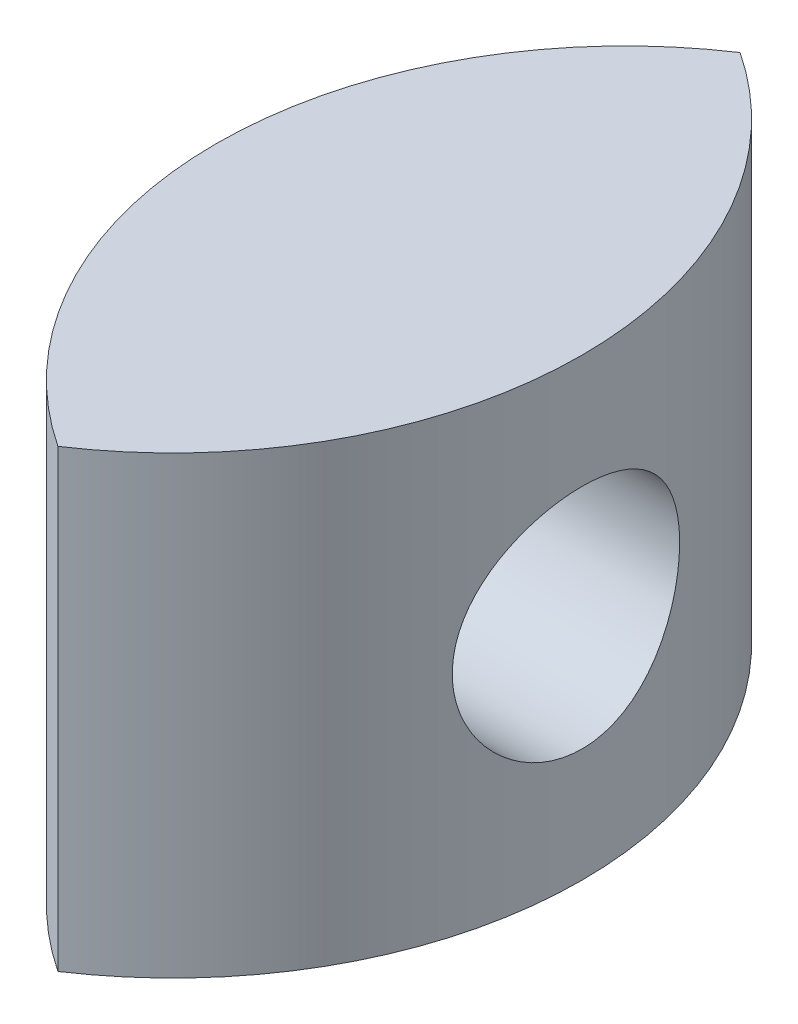
ISO-10303-21;
HEADER;
FILE_DESCRIPTION(('STEP AP214'),'2;1');
FILE_NAME('part.step','',(''),(''),'','','');
FILE_SCHEMA(('AUTOMOTIVE_DESIGN { 1 0 10303 214 1 1 1 1 }'));
ENDSEC;
DATA;
#1=APPLICATION_CONTEXT('core data for automotive mechanical design processes');
#2=APPLICATION_PROTOCOL_DEFINITION('international standard','automotive_design',2000,#1);
#3=PRODUCT_CONTEXT('',#1,'mechanical');
#4=PRODUCT('Part','Part','',(#3));
#5=PRODUCT_RELATED_PRODUCT_CATEGORY('part','',(#4));
#6=PRODUCT_DEFINITION_FORMATION('','',#4);
#7=PRODUCT_DEFINITION_CONTEXT('part definition',#1,'design');
#8=PRODUCT_DEFINITION('design','',#6,#7);
#9=PRODUCT_DEFINITION_SHAPE('','',#8);
#10=(LENGTH_UNIT() NAMED_UNIT(*) SI_UNIT(.MILLI.,.METRE.));
#11=(NAMED_UNIT(*) PLANE_ANGLE_UNIT() SI_UNIT($,.RADIAN.));
#12=(NAMED_UNIT(*) SI_UNIT($,.STERADIAN.) SOLID_ANGLE_UNIT());
#13=UNCERTAINTY_MEASURE_WITH_UNIT(LENGTH_MEASURE(1.E-05),#10,'distance_accuracy_value','');
#14=(GEOMETRIC_REPRESENTATION_CONTEXT(3) GLOBAL_UNCERTAINTY_ASSIGNED_CONTEXT((#13)) GLOBAL_UNIT_ASSIGNED_CONTEXT((#10,
#11,#12)) REPRESENTATION_CONTEXT('',''));
#15=CARTESIAN_POINT('',(0.,0.,0.));
#16=DIRECTION('',(0.,0.,1.));
#17=DIRECTION('',(1.,0.,0.));
#18=AXIS2_PLACEMENT_3D('',#15,#16,#17);
#19=CARTESIAN_POINT('',(-49.749371855331,100.,0.));
#20=DIRECTION('',(0.,-1.,0.));
#21=DIRECTION('',(0.,0.,-1.));
#22=AXIS2_PLACEMENT_3D('',#19,#20,#21);
#23=CYLINDRICAL_SURFACE('',#22,90.);
#24=CARTESIAN_POINT('',(36.7087104736219,50.,-25.));
#25=CARTESIAN_POINT('',(36.7087119584667,49.3125236925626,-24.9999978373599));
#26=CARTESIAN_POINT('',(36.7169325697667,48.6250072856748,-24.9716185127025));
#27=CARTESIAN_POINT('',(36.7495638608356,47.2550052019103,-24.8583494073153));
#28=CARTESIAN_POINT('',(36.7739758120084,46.5725199243521,-24.7734551888251));
#29=CARTESIAN_POINT('',(36.8382479200626,45.2173004770751,-24.5478683033964));
#30=CARTESIAN_POINT('',(36.8781141512689,44.5445702495854,-24.4071536956735));
#31=CARTESIAN_POINT('',(36.9720806210226,43.2139235869016,-24.0711458500836));
#32=CARTESIAN_POINT('',(37.0261806457025,42.5560069292901,-23.8758534322631));
#33=CARTESIAN_POINT('',(37.1469111934421,41.2604686096819,-23.432639854356));
#34=CARTESIAN_POINT('',(37.2135226183443,40.6228177248464,-23.184798834306));
#35=CARTESIAN_POINT('',(37.357399821172,39.3709664004644,-22.6382447832395));
#36=CARTESIAN_POINT('',(37.434665628854,38.7567660264185,-22.3395316101424));
#37=CARTESIAN_POINT('',(37.5976773926939,37.5556795277261,-21.6934079281237));
#38=CARTESIAN_POINT('',(37.6834238686412,36.9687950805483,-21.3459944337613));
#39=CARTESIAN_POINT('',(37.8610372263489,35.8259931277064,-20.604886979711));
#40=CARTESIAN_POINT('',(37.9529042218262,35.2700761977593,-20.2111921600297));
#41=CARTESIAN_POINT('',(38.1425927796659,34.1793502689555,-19.3698984655967));
#42=CARTESIAN_POINT('',(38.2405051547523,33.6453944075295,-18.9212136091496));
#43=CARTESIAN_POINT('',(38.4374559813241,32.6169214595317,-17.980936319365));
#44=CARTESIAN_POINT('',(38.5364944497509,32.1224049672011,-17.489343239754));
#45=CARTESIAN_POINT('',(38.7330020704521,31.1759499185994,-16.4663520986566));
#46=CARTESIAN_POINT('',(38.830471053198,30.7240159366495,-15.9349497717415));
#47=CARTESIAN_POINT('',(39.021182017181,29.8657920009903,-14.8357629533146));
#48=CARTESIAN_POINT('',(39.1144239738916,29.4595023121028,-14.2679782507475));
#49=CARTESIAN_POINT('',(39.2957252414571,28.6886849842625,-13.0893959348383));
#50=CARTESIAN_POINT('',(39.3836649527244,28.3250149132165,-12.4780185277527));
#51=CARTESIAN_POINT('',(39.5500566448419,27.6506205147449,-11.2254690643313));
#52=CARTESIAN_POINT('',(39.6285084814535,27.3398969922051,-10.5842965552432));
#53=CARTESIAN_POINT('',(39.773669841301,26.7739405631465,-9.27672295885907));
#54=CARTESIAN_POINT('',(39.8403810296831,26.5186997864419,-8.61032546547466));
#55=CARTESIAN_POINT('',(39.9601410213547,26.0658311904632,-7.25704033109933));
#56=CARTESIAN_POINT('',(40.0131902207225,25.8682017009431,-6.57015328477087));
#57=CARTESIAN_POINT('',(40.1029475058277,25.5364729101068,-5.19822223338651));
#58=CARTESIAN_POINT('',(40.1400275081839,25.4009224145853,-4.51355330398438));
#59=CARTESIAN_POINT('',(40.198670255679,25.187486272222,-3.1346258191073));
#60=CARTESIAN_POINT('',(40.2202332328689,25.1095997630379,-2.44036740719749));
#61=CARTESIAN_POINT('',(40.2472263675678,25.012205259846,-1.04756404807907));
#62=CARTESIAN_POINT('',(40.2526590579619,24.9926881002911,-0.349019791126764));
#63=CARTESIAN_POINT('',(40.2472432520002,25.0121864447438,1.04718219551885));
#64=CARTESIAN_POINT('',(40.2363950087114,25.0512010389484,1.74483993882321));
#65=CARTESIAN_POINT('',(40.199245475825,25.1855331760621,3.11496887722605));
#66=CARTESIAN_POINT('',(40.1733755662162,25.2792793754724,3.78760655475489));
#67=CARTESIAN_POINT('',(40.1072261654928,25.5209945309046,5.12232904057285));
#68=CARTESIAN_POINT('',(40.0669469830142,25.6689623255418,5.7844140745745));
#69=CARTESIAN_POINT('',(39.97304902464,26.0179021992923,7.09351046978246));
#70=CARTESIAN_POINT('',(39.9194297745418,26.218876162644,7.74052129424782));
#71=CARTESIAN_POINT('',(39.8002625984574,26.6722304914997,9.01513947247459));
#72=CARTESIAN_POINT('',(39.7347144713909,26.9246117235637,9.64274649894534));
#73=CARTESIAN_POINT('',(39.5926499031032,27.4817819246131,10.8809741735192));
#74=CARTESIAN_POINT('',(39.5160255106239,27.787093402063,11.4913472375099));
#75=CARTESIAN_POINT('',(39.354343378787,28.4460203740385,12.6842534843857));
#76=CARTESIAN_POINT('',(39.2692856094692,28.79963604017,13.2667865683565));
#77=CARTESIAN_POINT('',(39.0929294556891,29.5527871224068,14.4005107986214));
#78=CARTESIAN_POINT('',(39.0016299892009,29.9523305085074,14.9516964802118));
#79=CARTESIAN_POINT('',(38.8151608709692,30.7946594140811,16.0192770250537));
#80=CARTESIAN_POINT('',(38.7199911312508,31.2374459168294,16.5356710967517));
#81=CARTESIAN_POINT('',(38.5250488459202,32.1788788233121,17.5470989477399));
#82=CARTESIAN_POINT('',(38.4252284926243,32.6788933390497,18.0408509618632));
#83=CARTESIAN_POINT('',(38.2268499473707,33.7188426844479,18.9846518119587));
#84=CARTESIAN_POINT('',(38.1282917842011,34.2587784227399,19.4346996526578));
#85=CARTESIAN_POINT('',(37.9352027673689,35.3751302361837,20.2880960277346));
#86=CARTESIAN_POINT('',(37.840672234763,35.9515492104741,20.6914408436347));
#87=CARTESIAN_POINT('',(37.6583584004496,37.1370958253791,21.4485517286687));
#88=CARTESIAN_POINT('',(37.570575068501,37.7462233193722,21.8023180200212));
#89=CARTESIAN_POINT('',(37.4037326248509,38.9976874823907,22.460017444599));
#90=CARTESIAN_POINT('',(37.3247411645812,39.6402323802443,22.7635718652146));
#91=CARTESIAN_POINT('',(37.1786381148792,40.9500070582156,23.3152865727226));
#92=CARTESIAN_POINT('',(37.1115266277292,41.6172370508035,23.5634463826917));
#93=CARTESIAN_POINT('',(36.9913105607596,42.9714394907617,24.0022041362588));
#94=CARTESIAN_POINT('',(36.9382028520022,43.6584074898598,24.1928149397158));
#95=CARTESIAN_POINT('',(36.8476911397912,45.0470954586523,24.5148265178322));
#96=CARTESIAN_POINT('',(36.810286609358,45.7488149324751,24.6462292794522));
#97=CARTESIAN_POINT('',(36.7533452816235,47.1387757997168,24.845327209416));
#98=CARTESIAN_POINT('',(36.733270444918,47.8267205713889,24.9149428109611));
#99=CARTESIAN_POINT('',(36.7096032261963,49.2062906176748,24.9969493330663));
#100=CARTESIAN_POINT('',(36.706010490746,49.897915813049,25.0093414806982));
#101=CARTESIAN_POINT('',(36.7154198686201,51.2796241689367,24.9767905920429));
#102=CARTESIAN_POINT('',(36.7284202109627,51.9697074861408,24.9318536744962));
#103=CARTESIAN_POINT('',(36.7706046109094,53.3432876393305,24.7850658076762));
#104=CARTESIAN_POINT('',(36.7997885660947,54.0267845169709,24.6832152185838));
#105=CARTESIAN_POINT('',(36.8726445435354,55.3677184398248,24.426290275045));
#106=CARTESIAN_POINT('',(36.9159938526697,56.0254002912682,24.2723990037764));
#107=CARTESIAN_POINT('',(37.01605175114,57.3252057708842,23.9122595274744));
#108=CARTESIAN_POINT('',(37.0727601007662,57.9673296779949,23.7060122618931));
#109=CARTESIAN_POINT('',(37.1979203969383,59.2318793074743,23.242759929531));
#110=CARTESIAN_POINT('',(37.2663735564689,59.8543029873634,22.9857496196116));
#111=CARTESIAN_POINT('',(37.4131102251169,61.0754588922896,22.4228956768783));
#112=CARTESIAN_POINT('',(37.4913939732643,61.6741905407915,22.1170508566087));
#113=CARTESIAN_POINT('',(37.6576020020037,62.8580976919112,21.4509085207493));
#114=CARTESIAN_POINT('',(37.7457100660614,63.4426207290157,21.0894971544419));
#115=CARTESIAN_POINT('',(37.9275509517091,64.579357084396,20.3202693194868));
#116=CARTESIAN_POINT('',(38.0212838436353,65.1315699984753,19.9124522704966));
#117=CARTESIAN_POINT('',(38.2118462754509,66.2003862040661,19.0530263039524));
#118=CARTESIAN_POINT('',(38.3086763620161,66.7169831577777,18.6014096265639));
#119=CARTESIAN_POINT('',(38.5028333006917,67.7112820407914,17.6573073311238));
#120=CARTESIAN_POINT('',(38.6001601616814,68.188983272279,17.1648209801637));
#121=CARTESIAN_POINT('',(38.795798173433,69.1169923323564,16.1257881399337));
#122=CARTESIAN_POINT('',(38.8940425760459,69.5659501146415,15.578022190826));
#123=CARTESIAN_POINT('',(39.0855775790339,70.4161663933819,14.4458076704574));
#124=CARTESIAN_POINT('',(39.1788680643244,70.8174237819762,13.8613582476895));
#125=CARTESIAN_POINT('',(39.3578776047622,71.5693132751692,12.6596621259657));
#126=CARTESIAN_POINT('',(39.4435968733828,71.9199468073035,12.0424163525017));
#127=CARTESIAN_POINT('',(39.6050463073952,72.5679095779847,10.7792977426945));
#128=CARTESIAN_POINT('',(39.6807766458626,72.8652397401375,10.1334254026157));
#129=CARTESIAN_POINT('',(39.8195524727038,73.4021145949293,8.82262779743002));
#130=CARTESIAN_POINT('',(39.8826911016637,73.6420864097035,8.15788742610678));
#131=CARTESIAN_POINT('',(39.9952092180105,74.0651501858568,6.80939610883582));
#132=CARTESIAN_POINT('',(40.0445887266703,74.2482422351771,6.12564519228184));
#133=CARTESIAN_POINT('',(40.1281560625103,74.5558946737658,4.7443235570145));
#134=CARTESIAN_POINT('',(40.1623469467236,74.6804668416928,4.04675564881526));
#135=CARTESIAN_POINT('',(40.2145539830851,74.8699875943931,2.64297268493984));
#136=CARTESIAN_POINT('',(40.2325705869248,74.9349378442011,1.93675787130007));
#137=CARTESIAN_POINT('',(40.2515821157602,75.0034542524176,0.544682643020258));
#138=CARTESIAN_POINT('',(40.2531228499611,75.0089887484824,-0.141074199452578));
#139=CARTESIAN_POINT('',(40.2405556929542,74.9637244929425,-1.51057082638391));
#140=CARTESIAN_POINT('',(40.2264481715733,74.9129270726718,-2.194310658129));
#141=CARTESIAN_POINT('',(40.18297305304,74.7554513014685,-3.5547927229615));
#142=CARTESIAN_POINT('',(40.153606184799,74.6487756197374,-4.23153528872095));
#143=CARTESIAN_POINT('',(40.0804141489003,74.3804653597566,-5.5732354365324));
#144=CARTESIAN_POINT('',(40.0365889181396,74.2188305416394,-6.23819296713563));
#145=CARTESIAN_POINT('',(39.9360731046549,73.843477754109,-7.54638360915876));
#146=CARTESIAN_POINT('',(39.8794892908089,73.6301909903742,-8.18974880531733));
#147=CARTESIAN_POINT('',(39.7547496023096,73.1525564334994,-9.45605929388641));
#148=CARTESIAN_POINT('',(39.6865938338586,72.8882091089683,-10.0790047736377));
#149=CARTESIAN_POINT('',(39.5404697486794,72.3103991911703,-11.3005604171818));
#150=CARTESIAN_POINT('',(39.4625003307066,71.9969310848172,-11.8991678398755));
#151=CARTESIAN_POINT('',(39.2987540364114,71.3231210237317,-13.068272663989));
#152=CARTESIAN_POINT('',(39.2129769739244,70.9627779512301,-13.6387693946406));
#153=CARTESIAN_POINT('',(39.0332730862021,70.1867411316319,-14.7640024155415));
#154=CARTESIAN_POINT('',(38.9391837751556,69.7697637528657,-15.3178277741033));
#155=CARTESIAN_POINT('',(38.7475728074383,68.8916060387937,-16.3886145654833));
#156=CARTESIAN_POINT('',(38.6500510867078,68.4304248782279,-16.9055753097455));
#157=CARTESIAN_POINT('',(38.4541664338442,67.46673260844,-17.8995117381229));
#158=CARTESIAN_POINT('',(38.3558032929429,66.9642109588776,-18.3764771618823));
#159=CARTESIAN_POINT('',(38.1609211828342,65.9211207391434,-19.2872316187364));
#160=CARTESIAN_POINT('',(38.0644022241579,65.3805519517866,-19.7210204053311));
#161=CARTESIAN_POINT('',(37.8735490253337,64.2510884896215,-20.5526207350675));
#162=CARTESIAN_POINT('',(37.7793259849993,63.6613351334835,-20.9492926174597));
#163=CARTESIAN_POINT('',(37.5983620716777,62.4493214585279,-21.6914579896037));
#164=CARTESIAN_POINT('',(37.5116215277266,61.827059712113,-22.0369492292114));
#165=CARTESIAN_POINT('',(37.3482851380401,60.5546060269124,-22.6739111838681));
#166=CARTESIAN_POINT('',(37.2716839699025,59.9044289808311,-22.9654102730433));
#167=CARTESIAN_POINT('',(37.1309523820672,58.5804293555306,-23.492204951125));
#168=CARTESIAN_POINT('',(37.0668204114058,57.9066097293843,-23.7275075307884));
#169=CARTESIAN_POINT('',(36.9613576028578,56.6399485557023,-24.1098046923847));
#170=CARTESIAN_POINT('',(36.9180653457087,56.0496329226893,-24.2646740847685));
#171=CARTESIAN_POINT('',(36.843080596557,54.8585916152782,-24.5309265104396));
#172=CARTESIAN_POINT('',(36.8113867895949,54.2578671290634,-24.6423144734734));
#173=CARTESIAN_POINT('',(36.7603653174863,53.0494252917887,-24.8208382513816));
#174=CARTESIAN_POINT('',(36.7410362264239,52.441708755293,-24.8879791689127));
#175=CARTESIAN_POINT('',(36.7152075259606,51.2226722771844,-24.97756315902));
#176=CARTESIAN_POINT('',(36.7087091531941,50.6113519939344,-25.0000019231708));
#177=CARTESIAN_POINT('',(36.7087104736219,50.,-25.));
#178=B_SPLINE_CURVE_WITH_KNOTS('',3,(#24,#25,#26,#27,#28,#29,#30,#31,#32,#33,#34,#35,#36,#37,
#38,#39,#40,#41,#42,#43,#44,#45,#46,#47,#48,#49,#50,#51,#52,#53,#54,#55,#56,#57,#58,#59,#60,#61,
#62,#63,#64,#65,#66,#67,#68,#69,#70,#71,#72,#73,#74,#75,#76,#77,#78,#79,#80,#81,#82,#83,#84,#85,
#86,#87,#88,#89,#90,#91,#92,#93,#94,#95,#96,#97,#98,#99,#100,#101,#102,#103,#104,#105,#106,#107,
#108,#109,#110,#111,#112,#113,#114,#115,#116,#117,#118,#119,#120,#121,#122,#123,#124,#125,#126,
#127,#128,#129,#130,#131,#132,#133,#134,#135,#136,#137,#138,#139,#140,#141,#142,#143,#144,#145,
#146,#147,#148,#149,#150,#151,#152,#153,#154,#155,#156,#157,#158,#159,#160,#161,#162,#163,#164,
#165,#166,#167,#168,#169,#170,#171,#172,#173,#174,#175,#176,#177),.UNSPECIFIED.,.T.,.F.,(4,2,2,
2,2,2,2,2,2,2,2,2,2,2,2,2,2,2,2,2,2,2,2,2,2,2,2,2,2,2,2,2,2,2,2,2,2,2,2,2,2,2,2,2,2,2,2,2,2,2,2,
2,2,2,2,2,2,2,2,2,2,2,2,2,2,2,2,2,2,2,2,2,2,2,2,2,4),(0.,2.06186635872091,4.12389464198301,
6.18673423126287,8.24954282747685,10.3092278480517,12.3689186212039,14.4287357133568,
16.4885910868019,18.5990110240664,20.7094627534622,22.8201409350754,24.9308313619095,
27.0785457811604,29.2262928467468,31.373735056933,33.5211150030388,35.6153519914709,
37.7095576607769,39.8034344665752,41.8972787260055,43.9337748658363,45.9702273880454,
48.0067523108745,50.0433115657647,52.1012569520474,54.1592096495928,56.2175200114108,
58.275877186622,60.4026979988959,62.5295672338082,64.65660569299,66.7836346181512,
68.9260391167482,71.0684620597925,73.2104059036261,75.3522778606826,77.4249763087515,
79.4976303106775,81.5700631164076,83.6424828068007,85.6706444581721,87.6987697197007,
89.7271045688942,91.7554887464187,93.8316977078738,95.9079326369407,97.9845360799451,
100.061176770354,102.20370593841,104.346284857853,106.488803347175,108.631284708745,
110.757276907373,112.883265819015,115.008826636178,117.13432809195,119.189189282819,
121.244001910658,123.298716392832,125.353439842863,127.391567842159,129.4296771374,
131.468015344528,133.506402166289,135.602814298249,137.699265576679,139.796253041441,
141.893252477438,144.041549109183,146.189940162234,148.33719896264,150.484190508147,
152.317988984533,154.15157949193,155.984958509028,157.818514219957),.UNSPECIFIED.);
#179=CARTESIAN_POINT('',(36.7087104736219,50.,-25.));
#180=VERTEX_POINT('',#179);
#181=EDGE_CURVE('E76',#180,#180,#178,.T.);
#182=ORIENTED_EDGE('',*,*,#181,.T.);
#183=EDGE_LOOP('',(#182));
#184=FACE_BOUND('',#183,.T.);
#185=CARTESIAN_POINT('',(-49.749371855331,0.,0.));
#186=DIRECTION('',(0.,1.,0.));
#187=DIRECTION('',(0.,0.,-1.));
#188=AXIS2_PLACEMENT_3D('',#185,#186,#187);
#189=CIRCLE('',#188,90.);
#190=CARTESIAN_POINT('',(0.,0.,75.));
#191=VERTEX_POINT('',#190);
#192=CARTESIAN_POINT('',(0.,0.,-75.));
#193=VERTEX_POINT('',#192);
#194=EDGE_CURVE('E71',#191,#193,#189,.T.);
#195=ORIENTED_EDGE('',*,*,#194,.T.);
#196=DIRECTION('',(0.,-1.,0.));
#197=VECTOR('',#196,1.);
#198=CARTESIAN_POINT('',(0.,100.,-75.));
#199=LINE('',#198,#197);
#200=CARTESIAN_POINT('',(0.,100.,-75.));
#201=VERTEX_POINT('',#200);
#202=EDGE_CURVE('E46',#201,#193,#199,.T.);
#203=ORIENTED_EDGE('',*,*,#202,.F.);
#204=CARTESIAN_POINT('',(-49.749371855331,100.,0.));
#205=DIRECTION('',(0.,1.,0.));
#206=DIRECTION('',(0.,0.,-1.));
#207=AXIS2_PLACEMENT_3D('',#204,#205,#206);
#208=CIRCLE('',#207,90.);
#209=CARTESIAN_POINT('',(0.,100.,75.));
#210=VERTEX_POINT('',#209);
#211=EDGE_CURVE('E70',#210,#201,#208,.T.);
#212=ORIENTED_EDGE('',*,*,#211,.F.);
#213=DIRECTION('',(0.,-1.,0.));
#214=VECTOR('',#213,1.);
#215=CARTESIAN_POINT('',(0.,100.,75.));
#216=LINE('',#215,#214);
#217=EDGE_CURVE('E66',#210,#191,#216,.T.);
#218=ORIENTED_EDGE('',*,*,#217,.T.);
#219=EDGE_LOOP('',(#195,#203,#212,#218));
#220=FACE_BOUND('',#219,.T.);
#221=ADVANCED_FACE('F33',(#184,#220),#23,.T.);
#222=CARTESIAN_POINT('',(49.749371855331,100.,0.));
#223=DIRECTION('',(0.,-1.,0.));
#224=DIRECTION('',(0.,0.,-1.));
#225=AXIS2_PLACEMENT_3D('',#222,#223,#224);
#226=CYLINDRICAL_SURFACE('',#225,90.);
#227=CARTESIAN_POINT('',(-40.250628144669,25.,0.));
#228=CARTESIAN_POINT('',(-40.2506268480176,25.0000021362431,-0.688053459027479));
#229=CARTESIAN_POINT('',(-40.2427186551199,25.0284287480261,-1.37614682998241));
#230=CARTESIAN_POINT('',(-40.2113009553364,25.1418910713903,-2.74731932276445));
#231=CARTESIAN_POINT('',(-40.1877902343999,25.2269311881358,-3.43039805021415));
#232=CARTESIAN_POINT('',(-40.1258055204413,25.4529165033049,-4.78681414914998));
#233=CARTESIAN_POINT('',(-40.0873259599821,25.5938825029165,-5.46014779933895));
#234=CARTESIAN_POINT('',(-39.9964586417845,25.9305104860859,-6.7920162917443));
#235=CARTESIAN_POINT('',(-39.9440711044393,26.1261716029185,-7.45055136828744));
#236=CARTESIAN_POINT('',(-39.8268874562877,26.5702751198056,-8.74740678064957));
#237=CARTESIAN_POINT('',(-39.7621084858589,26.8186446625646,-9.38575363670099));
#238=CARTESIAN_POINT('',(-39.6218233005119,27.3663840619337,-10.6389412929378));
#239=CARTESIAN_POINT('',(-39.546317055247,27.6657540628216,-11.2537820266196));
#240=CARTESIAN_POINT('',(-39.3865625461653,28.3132941337391,-12.4560429901888));
#241=CARTESIAN_POINT('',(-39.3023138451703,28.661466644509,-13.043461846677));
#242=CARTESIAN_POINT('',(-39.127274419653,29.4041641629519,-14.1871951491561));
#243=CARTESIAN_POINT('',(-39.0364835810925,29.7986899787008,-14.7435090526455));
#244=CARTESIAN_POINT('',(-38.8486246525163,30.6408371751582,-15.8337573744878));
#245=CARTESIAN_POINT('',(-38.7514613370259,31.0894526745427,-16.366907697019));
#246=CARTESIAN_POINT('',(-38.5553874292287,32.029420294012,-17.3937568238539));
#247=CARTESIAN_POINT('',(-38.4564768124007,32.5207730142414,-17.8874550739584));
#248=CARTESIAN_POINT('',(-38.2595901181671,33.5431180590779,-18.8323013375951));
#249=CARTESIAN_POINT('',(-38.1616141676416,34.0741156814616,-19.2834436460489));
#250=CARTESIAN_POINT('',(-37.9693130843845,35.1723264356013,-20.1401365762106));
#251=CARTESIAN_POINT('',(-37.8749879797883,35.7395398463675,-20.5456868466064));
#252=CARTESIAN_POINT('',(-37.6909161745075,36.9176174522083,-21.3156213668648));
#253=CARTESIAN_POINT('',(-37.6012896240817,37.5291038269768,-21.6790832357307));
#254=CARTESIAN_POINT('',(-37.4312564040614,38.78184600464,-22.3530516446004));
#255=CARTESIAN_POINT('',(-37.350849881256,39.4231022812635,-22.6635573415443));
#256=CARTESIAN_POINT('',(-37.2017377569871,40.7308415774341,-23.229078839595));
#257=CARTESIAN_POINT('',(-37.1330303150996,41.3973206088999,-23.4841033703972));
#258=CARTESIAN_POINT('',(-37.0094710677334,42.7508026061808,-23.9365461654151));
#259=CARTESIAN_POINT('',(-36.9546188453153,43.4378049537005,-24.1339661631278));
#260=CARTESIAN_POINT('',(-36.8616888872157,44.8102870353686,-24.4653441227014));
#261=CARTESIAN_POINT('',(-36.8232352633093,45.4953966133471,-24.6007301493586));
#262=CARTESIAN_POINT('',(-36.7624140993017,46.8752439428144,-24.8137705005281));
#263=CARTESIAN_POINT('',(-36.7400463210227,47.569981551589,-24.8914256798428));
#264=CARTESIAN_POINT('',(-36.7121137868327,48.9637334544335,-24.9882782923526));
#265=CARTESIAN_POINT('',(-36.7065460456545,49.6627469665779,-25.0074861113031));
#266=CARTESIAN_POINT('',(-36.7123847152531,51.0598487822997,-24.9872921698781));
#267=CARTESIAN_POINT('',(-36.7237908229197,51.7579371021758,-24.9478914561038));
#268=CARTESIAN_POINT('',(-36.7626060783818,53.1266626945488,-24.8129479297352));
#269=CARTESIAN_POINT('',(-36.7895162352533,53.7974875664439,-24.7191551122261));
#270=CARTESIAN_POINT('',(-36.8581362130491,55.128569951887,-24.4776486170805));
#271=CARTESIAN_POINT('',(-36.8998456881758,55.788827711967,-24.3299361993148));
#272=CARTESIAN_POINT('',(-36.9968406521905,57.0943071002752,-23.9818101716595));
#273=CARTESIAN_POINT('',(-37.0521269403465,57.7395278408234,-23.7813934590147));
#274=CARTESIAN_POINT('',(-37.1746832849849,59.0106390347531,-23.329453589635));
#275=CARTESIAN_POINT('',(-37.241953570624,59.6365291182273,-23.0779294556164));
#276=CARTESIAN_POINT('',(-37.3874619870474,60.8723934657622,-22.5223354613893));
#277=CARTESIAN_POINT('',(-37.4658225856028,61.4820848210566,-22.217668583802));
#278=CARTESIAN_POINT('',(-37.6306899089398,62.6737320634022,-21.5601398428964));
#279=CARTESIAN_POINT('',(-37.7171966679159,63.2556878340145,-21.20727777727));
#280=CARTESIAN_POINT('',(-37.8960113592544,64.3884008831009,-20.4557077016635));
#281=CARTESIAN_POINT('',(-37.9883203126044,64.9391526381335,-20.0569916126452));
#282=CARTESIAN_POINT('',(-38.176262820265,66.0060311186194,-19.2163530661829));
#283=CARTESIAN_POINT('',(-38.2718964527015,66.5221570295715,-18.7744295929751));
#284=CARTESIAN_POINT('',(-38.4673974949316,67.5343580856984,-17.8336891653759));
#285=CARTESIAN_POINT('',(-38.5672945330294,68.0290676925872,-17.3334079487126));
#286=CARTESIAN_POINT('',(-38.7651893721196,68.9747572464025,-16.2927268259751));
#287=CARTESIAN_POINT('',(-38.8631871273155,69.4257361399172,-15.7523259540277));
#288=CARTESIAN_POINT('',(-39.0545796114286,70.2809154417185,-14.6348723402889));
#289=CARTESIAN_POINT('',(-39.1479740829322,70.6851132357249,-14.0578175529455));
#290=CARTESIAN_POINT('',(-39.3275693503912,71.4438184432015,-12.8708496177953));
#291=CARTESIAN_POINT('',(-39.4137701950819,71.7983261933215,-12.2609366926411));
#292=CARTESIAN_POINT('',(-39.5769924666817,72.4566609630222,-11.0091325902728));
#293=CARTESIAN_POINT('',(-39.6539650002985,72.7602211744739,-10.3670946075276));
#294=CARTESIAN_POINT('',(-39.7960298057722,73.3120157663253,-9.05837792908488));
#295=CARTESIAN_POINT('',(-39.8611219882144,73.560249730328,-8.39169904797886));
#296=CARTESIAN_POINT('',(-39.9775389670089,73.9992363035367,-7.03863757310164));
#297=CARTESIAN_POINT('',(-40.0288664237474,74.1900000212216,-6.3522588152672));
#298=CARTESIAN_POINT('',(-40.1162711919523,74.5124033896582,-4.96480361305482));
#299=CARTESIAN_POINT('',(-40.1523489747055,74.6440448675736,-4.26372762359357));
#300=CARTESIAN_POINT('',(-40.2073226007912,74.8438279890382,-2.87426453587184));
#301=CARTESIAN_POINT('',(-40.2267188704494,74.9138207175327,-2.18616289680624));
#302=CARTESIAN_POINT('',(-40.2496616966572,74.9965525409134,-0.806267754641642));
#303=CARTESIAN_POINT('',(-40.2532085825807,75.0092928255914,-0.114474328562655));
#304=CARTESIAN_POINT('',(-40.2443539860166,74.9774081475188,1.26761171313175));
#305=CARTESIAN_POINT('',(-40.2319541449507,74.9327890888565,1.95790447588728));
#306=CARTESIAN_POINT('',(-40.1915555622891,74.786596214821,3.33196556264267));
#307=CARTESIAN_POINT('',(-40.1635569062907,74.685022711981,4.01573392242374));
#308=CARTESIAN_POINT('',(-40.0934109463147,74.4282733176039,5.35892993780301));
#309=CARTESIAN_POINT('',(-40.0515413481917,74.2741479086251,6.01857335434763));
#310=CARTESIAN_POINT('',(-39.9546500830356,73.9132128854045,7.32227593293668));
#311=CARTESIAN_POINT('',(-39.899628630497,73.7064041303754,7.96633534895301));
#312=CARTESIAN_POINT('',(-39.7778697508985,73.2417132970964,9.23466084408807));
#313=CARTESIAN_POINT('',(-39.7111313797474,72.9838271030644,9.85892532343979));
#314=CARTESIAN_POINT('',(-39.5676676988653,72.4189239784323,11.0836197519047));
#315=CARTESIAN_POINT('',(-39.490942171656,72.1119059779136,11.6840491816186));
#316=CARTESIAN_POINT('',(-39.3277865121704,71.444046592064,12.8695491594938));
#317=CARTESIAN_POINT('',(-39.241187789478,71.0822189550754,13.4540409117292));
#318=CARTESIAN_POINT('',(-39.0619140645377,70.3121802578934,14.5906326252893));
#319=CARTESIAN_POINT('',(-38.9692389948618,69.9039686829504,15.1427322270362));
#320=CARTESIAN_POINT('',(-38.7802300031198,69.0438028607643,16.2112323037594));
#321=CARTESIAN_POINT('',(-38.6838954018884,68.5918404695568,16.7276261015181));
#322=CARTESIAN_POINT('',(-38.4901166739549,67.6471252606579,17.7214284980658));
#323=CARTESIAN_POINT('',(-38.3926725268573,67.1543716920976,18.1988363788949));
#324=CARTESIAN_POINT('',(-38.1962729917449,66.1153522833139,19.1257655836489));
#325=CARTESIAN_POINT('',(-38.097363619339,65.5679050804053,19.5739735523737));
#326=CARTESIAN_POINT('',(-37.9039310616419,64.4364858559352,20.4227328687772));
#327=CARTESIAN_POINT('',(-37.8094079758085,63.8525130068697,20.8232831361533));
#328=CARTESIAN_POINT('',(-37.6275029394412,62.6518877484519,21.5738481418225));
#329=CARTESIAN_POINT('',(-37.5401208881514,62.0352358003856,21.9238635931869));
#330=CARTESIAN_POINT('',(-37.3751061049751,60.7733848649819,22.5707071244204));
#331=CARTESIAN_POINT('',(-37.2974732192162,60.1281863284166,22.8675360437718));
#332=CARTESIAN_POINT('',(-37.1547381513963,58.8173880350394,23.4041100047765));
#333=CARTESIAN_POINT('',(-37.0895681563684,58.1519229376155,23.6441657560855));
#334=CARTESIAN_POINT('',(-36.9732533664462,56.8019035385072,24.0672906639622));
#335=CARTESIAN_POINT('',(-36.9221085642731,56.1173492467297,24.2503598501043));
#336=CARTESIAN_POINT('',(-36.8354894773903,54.7343767657802,24.557836619146));
#337=CARTESIAN_POINT('',(-36.8000114814542,54.0359619009716,24.6822580952606));
#338=CARTESIAN_POINT('',(-36.7458663301651,52.6304492590456,24.871338769631));
#339=CARTESIAN_POINT('',(-36.7271986491263,51.9233517541494,24.9359998366934));
#340=CARTESIAN_POINT('',(-36.7076420154972,50.5312842412111,25.0037178244284));
#341=CARTESIAN_POINT('',(-36.7061425133686,49.846424851015,25.0088903582344));
#342=CARTESIAN_POINT('',(-36.7193891387678,48.4787588219459,24.9630516719875));
#343=CARTESIAN_POINT('',(-36.7341348593922,47.7959521320874,24.9120418591658));
#344=CARTESIAN_POINT('',(-36.7794174482756,46.4373700087499,24.7542991221064));
#345=CARTESIAN_POINT('',(-36.8099537445546,45.7615943214921,24.6475682162457));
#346=CARTESIAN_POINT('',(-36.8858882711677,44.4218622486172,24.3793170110374));
#347=CARTESIAN_POINT('',(-36.9312865761258,43.7579059223643,24.2177964365837));
#348=CARTESIAN_POINT('',(-37.0351101961971,42.4524241390367,23.8430508456458));
#349=CARTESIAN_POINT('',(-37.0934125437636,41.8107490501896,23.6303123275838));
#350=CARTESIAN_POINT('',(-37.2216025592651,40.5477444117314,23.154057360024));
#351=CARTESIAN_POINT('',(-37.2914901105547,39.9264146573489,22.8905414217739));
#352=CARTESIAN_POINT('',(-37.4409072497649,38.7079465990992,22.3146516548029));
#353=CARTESIAN_POINT('',(-37.5204380879497,38.1108114455106,22.002271489248));
#354=CARTESIAN_POINT('',(-37.6869699383814,36.9444605593803,21.3308630067886));
#355=CARTESIAN_POINT('',(-37.7739711454291,36.3752455555059,20.9718334733086));
#356=CARTESIAN_POINT('',(-37.9559767734925,35.2505641813866,20.1973999504647));
#357=CARTESIAN_POINT('',(-38.0511475420254,34.6961070914173,19.7805686986438));
#358=CARTESIAN_POINT('',(-38.2443485320158,33.624013781895,18.9025705033327));
#359=CARTESIAN_POINT('',(-38.3423788117655,33.1063783137042,18.4414026555849));
#360=CARTESIAN_POINT('',(-38.5386540845406,32.111074396674,17.4775951598802));
#361=CARTESIAN_POINT('',(-38.63689912264,31.6334153758779,16.9749457841234));
#362=CARTESIAN_POINT('',(-38.8309343047444,30.7212738410349,15.9314453283163));
#363=CARTESIAN_POINT('',(-38.9267244384283,30.2867915084888,15.390594087694));
#364=CARTESIAN_POINT('',(-39.11550611822,29.454077380899,14.2607572211456));
#365=CARTESIAN_POINT('',(-39.2083764428604,29.0569572083812,13.6709312761684));
#366=CARTESIAN_POINT('',(-39.3862339919605,28.3139120147392,12.4586919359519));
#367=CARTESIAN_POINT('',(-39.4712208758242,27.9679892051603,11.8362771345603));
#368=CARTESIAN_POINT('',(-39.6308513895866,27.3302047093519,10.5634669001581));
#369=CARTESIAN_POINT('',(-39.7055003362416,27.0383152078234,9.91308607719801));
#370=CARTESIAN_POINT('',(-39.8423558402498,26.510797490351,8.58867245825372));
#371=CARTESIAN_POINT('',(-39.9045639201112,26.2751623893319,7.91464256831451));
#372=CARTESIAN_POINT('',(-40.0067390658762,25.8921529311921,6.64712163151897));
#373=CARTESIAN_POINT('',(-40.0486238124974,25.7369318686892,6.05614200799706));
#374=CARTESIAN_POINT('',(-40.1210917664744,25.4700843785057,4.86378182488804));
#375=CARTESIAN_POINT('',(-40.1516762500816,25.3584530277235,4.26240244788444));
#376=CARTESIAN_POINT('',(-40.2008795751773,25.1795419102313,3.05265430146974));
#377=CARTESIAN_POINT('',(-40.2194995830302,25.1122578202845,2.4442862192442));
#378=CARTESIAN_POINT('',(-40.2443750406049,25.022483755323,1.22395617714019));
#379=CARTESIAN_POINT('',(-40.2506292979845,24.9999980999039,0.611993876402014));
#380=CARTESIAN_POINT('',(-40.250628144669,25.,0.));
#381=B_SPLINE_CURVE_WITH_KNOTS('',3,(#227,#228,#229,#230,#231,#232,#233,#234,#235,#236,#237,
#238,#239,#240,#241,#242,#243,#244,#245,#246,#247,#248,#249,#250,#251,#252,#253,#254,#255,#256,
#257,#258,#259,#260,#261,#262,#263,#264,#265,#266,#267,#268,#269,#270,#271,#272,#273,#274,#275,
#276,#277,#278,#279,#280,#281,#282,#283,#284,#285,#286,#287,#288,#289,#290,#291,#292,#293,#294,
#295,#296,#297,#298,#299,#300,#301,#302,#303,#304,#305,#306,#307,#308,#309,#310,#311,#312,#313,
#314,#315,#316,#317,#318,#319,#320,#321,#322,#323,#324,#325,#326,#327,#328,#329,#330,#331,#332,
#333,#334,#335,#336,#337,#338,#339,#340,#341,#342,#343,#344,#345,#346,#347,#348,#349,#350,#351,
#352,#353,#354,#355,#356,#357,#358,#359,#360,#361,#362,#363,#364,#365,#366,#367,#368,#369,#370,
#371,#372,#373,#374,#375,#376,#377,#378,#379,#380),.UNSPECIFIED.,.T.,.F.,(4,2,2,2,2,2,2,2,2,2,2,
2,2,2,2,2,2,2,2,2,2,2,2,2,2,2,2,2,2,2,2,2,2,2,2,2,2,2,2,2,2,2,2,2,2,2,2,2,2,2,2,2,2,2,2,2,2,2,2,
2,2,2,2,2,2,2,2,2,2,2,2,2,2,2,2,2,4),(0.,2.06359950472729,4.12735959936295,6.1918880138908,
8.25638371475313,10.3180440984036,12.3797103144838,14.4414796766631,16.5032849869457,
18.6114340917477,20.71961280537,22.8280737423907,24.9365509251671,27.0848587914887,
29.2332008555841,31.3812046434835,33.5291437846967,35.6247878283964,37.7204008419438,
39.8156414555158,41.910844653801,43.9421080611408,45.9733240095725,48.0046595645262,
50.0360339666365,52.0919023078583,54.1477792792234,56.2040190328936,58.2603071383909,
60.3897126760021,62.5191694952891,64.6487452581607,66.7783065924689,68.9186940012215,
71.0590975184367,73.199087049168,75.3390104392974,77.4122442646754,79.4854350049467,
81.5584123654901,83.6313783508399,85.6651250660307,87.6988386149709,89.7327161057556,
91.766637893289,93.8428431347057,95.9190714192339,97.9956869276953,100.072340670234,
102.21301191495,104.353731675062,106.494421225605,108.635076985089,110.763731195009,
112.892384300217,115.020532889278,117.14861492537,119.200770924077,121.252875522433,
123.304905792863,125.356946366958,127.390215279668,129.423463721671,131.456976059298,
133.490541439836,135.588629994794,137.686761349947,139.785386142045,141.884019755716,
144.032702240535,146.181477513777,148.329143544306,150.476546583293,152.312238730714,
154.147723491707,155.983029292173,157.81851204961),.UNSPECIFIED.);
#382=CARTESIAN_POINT('',(-40.250628144669,25.,0.));
#383=VERTEX_POINT('',#382);
#384=EDGE_CURVE('E11',#383,#383,#381,.T.);
#385=ORIENTED_EDGE('',*,*,#384,.T.);
#386=EDGE_LOOP('',(#385));
#387=FACE_BOUND('',#386,.T.);
#388=CARTESIAN_POINT('',(49.749371855331,0.,0.));
#389=DIRECTION('',(0.,1.,0.));
#390=DIRECTION('',(0.,0.,1.));
#391=AXIS2_PLACEMENT_3D('',#388,#389,#390);
#392=CIRCLE('',#391,90.);
#393=EDGE_CURVE('E61',#193,#191,#392,.T.);
#394=ORIENTED_EDGE('',*,*,#393,.T.);
#395=ORIENTED_EDGE('',*,*,#217,.F.);
#396=CARTESIAN_POINT('',(49.749371855331,100.,0.));
#397=DIRECTION('',(0.,1.,0.));
#398=DIRECTION('',(0.,0.,1.));
#399=AXIS2_PLACEMENT_3D('',#396,#397,#398);
#400=CIRCLE('',#399,90.);
#401=EDGE_CURVE('E53',#201,#210,#400,.T.);
#402=ORIENTED_EDGE('',*,*,#401,.F.);
#403=ORIENTED_EDGE('',*,*,#202,.T.);
#404=EDGE_LOOP('',(#394,#395,#402,#403));
#405=FACE_BOUND('',#404,.T.);
#406=ADVANCED_FACE('F65',(#387,#405),#226,.T.);
#407=CARTESIAN_POINT('',(0.,100.,0.));
#408=DIRECTION('',(0.,-1.,0.));
#409=DIRECTION('',(0.,0.,-1.));
#410=AXIS2_PLACEMENT_3D('',#407,#408,#409);
#411=PLANE('',#410);
#412=ORIENTED_EDGE('',*,*,#211,.T.);
#413=ORIENTED_EDGE('',*,*,#401,.T.);
#414=EDGE_LOOP('',(#412,#413));
#415=FACE_BOUND('',#414,.T.);
#416=ADVANCED_FACE('F90',(#415),#411,.F.);
#417=CARTESIAN_POINT('',(0.,0.,0.));
#418=DIRECTION('',(0.,-1.,0.));
#419=DIRECTION('',(0.,0.,-1.));
#420=AXIS2_PLACEMENT_3D('',#417,#418,#419);
#421=PLANE('',#420);
#422=ORIENTED_EDGE('',*,*,#194,.F.);
#423=ORIENTED_EDGE('',*,*,#393,.F.);
#424=EDGE_LOOP('',(#422,#423));
#425=FACE_BOUND('',#424,.T.);
#426=ADVANCED_FACE('F75',(#425),#421,.T.);
#427=CARTESIAN_POINT('',(-40.250628144669,50.,0.));
#428=DIRECTION('',(1.,0.,0.));
#429=DIRECTION('',(0.,0.,-1.));
#430=AXIS2_PLACEMENT_3D('',#427,#428,#429);
#431=CYLINDRICAL_SURFACE('',#430,25.);
#432=ORIENTED_EDGE('',*,*,#384,.F.);
#433=EDGE_LOOP('',(#432));
#434=FACE_BOUND('',#433,.T.);
#435=ORIENTED_EDGE('',*,*,#181,.F.);
#436=EDGE_LOOP('',(#435));
#437=FACE_BOUND('',#436,.T.);
#438=ADVANCED_FACE('F85',(#434,#437),#431,.F.);
#439=CLOSED_SHELL('',(#221,#406,#416,#426,#438));
#440=MANIFOLD_SOLID_BREP('B2',#439);
#441=ADVANCED_BREP_SHAPE_REPRESENTATION('',(#18,#440),#14);
#442=SHAPE_DEFINITION_REPRESENTATION(#9,#441);
ENDSEC;
END-ISO-10303-21;
